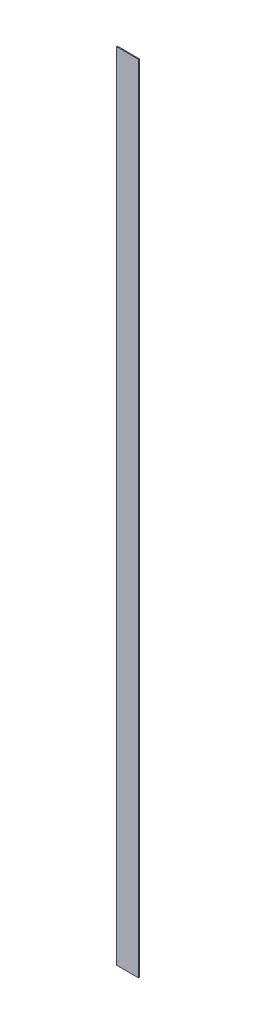
ISO-10303-21;
HEADER;
FILE_DESCRIPTION(('STEP AP214'),'2;1');
FILE_NAME('part.step','',(''),(''),'','','');
FILE_SCHEMA(('AUTOMOTIVE_DESIGN { 1 0 10303 214 1 1 1 1 }'));
ENDSEC;
DATA;
#1=APPLICATION_CONTEXT('core data for automotive mechanical design processes');
#2=APPLICATION_PROTOCOL_DEFINITION('international standard','automotive_design',2000,#1);
#3=PRODUCT_CONTEXT('',#1,'mechanical');
#4=PRODUCT('Part','Part','',(#3));
#5=PRODUCT_RELATED_PRODUCT_CATEGORY('part','',(#4));
#6=PRODUCT_DEFINITION_FORMATION('','',#4);
#7=PRODUCT_DEFINITION_CONTEXT('part definition',#1,'design');
#8=PRODUCT_DEFINITION('design','',#6,#7);
#9=PRODUCT_DEFINITION_SHAPE('','',#8);
#10=(LENGTH_UNIT() NAMED_UNIT(*) SI_UNIT(.MILLI.,.METRE.));
#11=(NAMED_UNIT(*) PLANE_ANGLE_UNIT() SI_UNIT($,.RADIAN.));
#12=(NAMED_UNIT(*) SI_UNIT($,.STERADIAN.) SOLID_ANGLE_UNIT());
#13=UNCERTAINTY_MEASURE_WITH_UNIT(LENGTH_MEASURE(1.E-05),#10,'distance_accuracy_value','');
#14=(GEOMETRIC_REPRESENTATION_CONTEXT(3) GLOBAL_UNCERTAINTY_ASSIGNED_CONTEXT((#13)) GLOBAL_UNIT_ASSIGNED_CONTEXT((#10,
#11,#12)) REPRESENTATION_CONTEXT('',''));
#15=CARTESIAN_POINT('',(0.,0.,0.));
#16=DIRECTION('',(0.,0.,1.));
#17=DIRECTION('',(1.,0.,0.));
#18=AXIS2_PLACEMENT_3D('',#15,#16,#17);
#19=CARTESIAN_POINT('',(24.9999999999999,890.,1.));
#20=DIRECTION('',(-1.,0.,0.));
#21=DIRECTION('',(0.,-1.,0.));
#22=AXIS2_PLACEMENT_3D('',#19,#20,#21);
#23=PLANE('',#22);
#24=DIRECTION('',(0.,1.,0.));
#25=VECTOR('',#24,1.);
#26=CARTESIAN_POINT('',(24.9999999999999,890.,-1.));
#27=LINE('',#26,#25);
#28=CARTESIAN_POINT('',(25.0000000000001,-890.,-1.));
#29=VERTEX_POINT('',#28);
#30=CARTESIAN_POINT('',(24.9999999999999,890.,-1.));
#31=VERTEX_POINT('',#30);
#32=EDGE_CURVE('E97',#29,#31,#27,.T.);
#33=ORIENTED_EDGE('',*,*,#32,.T.);
#34=DIRECTION('',(0.,0.,-1.));
#35=VECTOR('',#34,1.);
#36=CARTESIAN_POINT('',(24.9999999999999,890.,1.));
#37=LINE('',#36,#35);
#38=CARTESIAN_POINT('',(24.9999999999999,890.,1.));
#39=VERTEX_POINT('',#38);
#40=EDGE_CURVE('E11',#39,#31,#37,.T.);
#41=ORIENTED_EDGE('',*,*,#40,.F.);
#42=DIRECTION('',(0.,1.,0.));
#43=VECTOR('',#42,1.);
#44=CARTESIAN_POINT('',(24.9999999999999,890.,1.));
#45=LINE('',#44,#43);
#46=CARTESIAN_POINT('',(25.0000000000001,-890.,1.));
#47=VERTEX_POINT('',#46);
#48=EDGE_CURVE('E85',#47,#39,#45,.T.);
#49=ORIENTED_EDGE('',*,*,#48,.F.);
#50=DIRECTION('',(0.,0.,-1.));
#51=VECTOR('',#50,1.);
#52=CARTESIAN_POINT('',(25.0000000000001,-890.,1.));
#53=LINE('',#52,#51);
#54=EDGE_CURVE('E93',#47,#29,#53,.T.);
#55=ORIENTED_EDGE('',*,*,#54,.T.);
#56=EDGE_LOOP('',(#33,#41,#49,#55));
#57=FACE_BOUND('',#56,.T.);
#58=ADVANCED_FACE('F34',(#57),#23,.F.);
#59=CARTESIAN_POINT('',(-25.0000000000001,890.,1.));
#60=DIRECTION('',(0.,-1.,0.));
#61=DIRECTION('',(0.,0.,-1.));
#62=AXIS2_PLACEMENT_3D('',#59,#60,#61);
#63=PLANE('',#62);
#64=DIRECTION('',(-1.,0.,0.));
#65=VECTOR('',#64,1.);
#66=CARTESIAN_POINT('',(-25.0000000000001,890.,-1.));
#67=LINE('',#66,#65);
#68=CARTESIAN_POINT('',(-25.0000000000001,890.,-1.));
#69=VERTEX_POINT('',#68);
#70=EDGE_CURVE('E89',#31,#69,#67,.T.);
#71=ORIENTED_EDGE('',*,*,#70,.T.);
#72=DIRECTION('',(0.,0.,-1.));
#73=VECTOR('',#72,1.);
#74=CARTESIAN_POINT('',(-25.0000000000001,890.,1.));
#75=LINE('',#74,#73);
#76=CARTESIAN_POINT('',(-25.0000000000001,890.,1.));
#77=VERTEX_POINT('',#76);
#78=EDGE_CURVE('E42',#77,#69,#75,.T.);
#79=ORIENTED_EDGE('',*,*,#78,.F.);
#80=DIRECTION('',(-1.,0.,0.));
#81=VECTOR('',#80,1.);
#82=CARTESIAN_POINT('',(-25.0000000000001,890.,1.));
#83=LINE('',#82,#81);
#84=EDGE_CURVE('E80',#39,#77,#83,.T.);
#85=ORIENTED_EDGE('',*,*,#84,.F.);
#86=ORIENTED_EDGE('',*,*,#40,.T.);
#87=EDGE_LOOP('',(#71,#79,#85,#86));
#88=FACE_BOUND('',#87,.T.);
#89=ADVANCED_FACE('F88',(#88),#63,.F.);
#90=CARTESIAN_POINT('',(-25.0000000000001,890.,1.));
#91=DIRECTION('',(1.,0.,0.));
#92=DIRECTION('',(0.,1.,0.));
#93=AXIS2_PLACEMENT_3D('',#90,#91,#92);
#94=PLANE('',#93);
#95=DIRECTION('',(0.,-1.,0.));
#96=VECTOR('',#95,1.);
#97=CARTESIAN_POINT('',(-25.0000000000001,890.,-1.));
#98=LINE('',#97,#96);
#99=CARTESIAN_POINT('',(-24.9999999999999,-890.,-1.));
#100=VERTEX_POINT('',#99);
#101=EDGE_CURVE('E67',#69,#100,#98,.T.);
#102=ORIENTED_EDGE('',*,*,#101,.T.);
#103=DIRECTION('',(0.,0.,-1.));
#104=VECTOR('',#103,1.);
#105=CARTESIAN_POINT('',(-24.9999999999999,-890.,1.));
#106=LINE('',#105,#104);
#107=CARTESIAN_POINT('',(-24.9999999999999,-890.,1.));
#108=VERTEX_POINT('',#107);
#109=EDGE_CURVE('E90',#108,#100,#106,.T.);
#110=ORIENTED_EDGE('',*,*,#109,.F.);
#111=DIRECTION('',(0.,-1.,0.));
#112=VECTOR('',#111,1.);
#113=CARTESIAN_POINT('',(-25.0000000000001,890.,1.));
#114=LINE('',#113,#112);
#115=EDGE_CURVE('E83',#77,#108,#114,.T.);
#116=ORIENTED_EDGE('',*,*,#115,.F.);
#117=ORIENTED_EDGE('',*,*,#78,.T.);
#118=EDGE_LOOP('',(#102,#110,#116,#117));
#119=FACE_BOUND('',#118,.T.);
#120=ADVANCED_FACE('F91',(#119),#94,.F.);
#121=CARTESIAN_POINT('',(-24.9999999999999,-890.,1.));
#122=DIRECTION('',(0.,1.,0.));
#123=DIRECTION('',(0.,0.,1.));
#124=AXIS2_PLACEMENT_3D('',#121,#122,#123);
#125=PLANE('',#124);
#126=DIRECTION('',(1.,0.,0.));
#127=VECTOR('',#126,1.);
#128=CARTESIAN_POINT('',(-24.9999999999999,-890.,-1.));
#129=LINE('',#128,#127);
#130=EDGE_CURVE('E73',#100,#29,#129,.T.);
#131=ORIENTED_EDGE('',*,*,#130,.T.);
#132=ORIENTED_EDGE('',*,*,#54,.F.);
#133=DIRECTION('',(1.,0.,0.));
#134=VECTOR('',#133,1.);
#135=CARTESIAN_POINT('',(-24.9999999999999,-890.,1.));
#136=LINE('',#135,#134);
#137=EDGE_CURVE('E50',#108,#47,#136,.T.);
#138=ORIENTED_EDGE('',*,*,#137,.F.);
#139=ORIENTED_EDGE('',*,*,#109,.T.);
#140=EDGE_LOOP('',(#131,#132,#138,#139));
#141=FACE_BOUND('',#140,.T.);
#142=ADVANCED_FACE('F104',(#141),#125,.F.);
#143=CARTESIAN_POINT('',(0.,0.,1.));
#144=DIRECTION('',(0.,0.,1.));
#145=DIRECTION('',(1.,0.,0.));
#146=AXIS2_PLACEMENT_3D('',#143,#144,#145);
#147=PLANE('',#146);
#148=ORIENTED_EDGE('',*,*,#48,.T.);
#149=ORIENTED_EDGE('',*,*,#84,.T.);
#150=ORIENTED_EDGE('',*,*,#115,.T.);
#151=ORIENTED_EDGE('',*,*,#137,.T.);
#152=EDGE_LOOP('',(#148,#149,#150,#151));
#153=FACE_BOUND('',#152,.T.);
#154=ADVANCED_FACE('F81',(#153),#147,.T.);
#155=CARTESIAN_POINT('',(0.,0.,-1.));
#156=DIRECTION('',(0.,0.,1.));
#157=DIRECTION('',(1.,0.,0.));
#158=AXIS2_PLACEMENT_3D('',#155,#156,#157);
#159=PLANE('',#158);
#160=ORIENTED_EDGE('',*,*,#32,.F.);
#161=ORIENTED_EDGE('',*,*,#130,.F.);
#162=ORIENTED_EDGE('',*,*,#101,.F.);
#163=ORIENTED_EDGE('',*,*,#70,.F.);
#164=EDGE_LOOP('',(#160,#161,#162,#163));
#165=FACE_BOUND('',#164,.T.);
#166=ADVANCED_FACE('F107',(#165),#159,.F.);
#167=CLOSED_SHELL('',(#58,#89,#120,#142,#154,#166));
#168=MANIFOLD_SOLID_BREP('B2',#167);
#169=ADVANCED_BREP_SHAPE_REPRESENTATION('',(#18,#168),#14);
#170=SHAPE_DEFINITION_REPRESENTATION(#9,#169);
ENDSEC;
END-ISO-10303-21;
